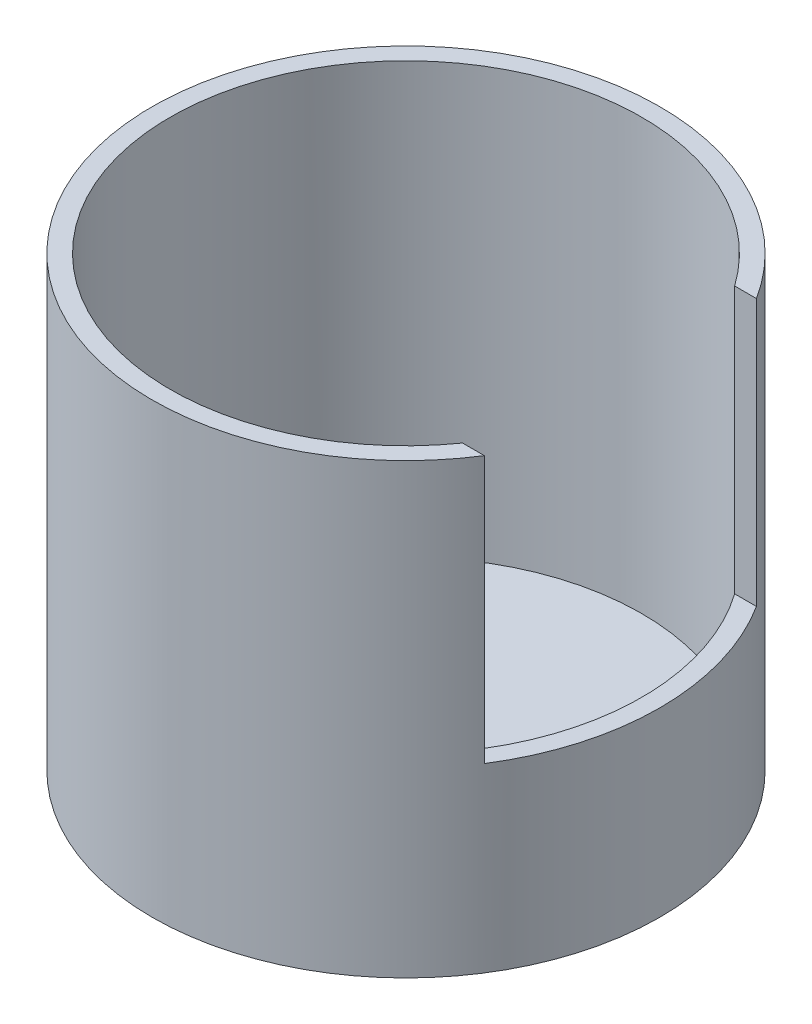
ISO-10303-21;
HEADER;
FILE_DESCRIPTION(('STEP AP214'),'2;1');
FILE_NAME('part.step','',(''),(''),'','','');
FILE_SCHEMA(('AUTOMOTIVE_DESIGN { 1 0 10303 214 1 1 1 1 }'));
ENDSEC;
DATA;
#1=APPLICATION_CONTEXT('core data for automotive mechanical design processes');
#2=APPLICATION_PROTOCOL_DEFINITION('international standard','automotive_design',2000,#1);
#3=PRODUCT_CONTEXT('',#1,'mechanical');
#4=PRODUCT('Part','Part','',(#3));
#5=PRODUCT_RELATED_PRODUCT_CATEGORY('part','',(#4));
#6=PRODUCT_DEFINITION_FORMATION('','',#4);
#7=PRODUCT_DEFINITION_CONTEXT('part definition',#1,'design');
#8=PRODUCT_DEFINITION('design','',#6,#7);
#9=PRODUCT_DEFINITION_SHAPE('','',#8);
#10=(LENGTH_UNIT() NAMED_UNIT(*) SI_UNIT(.MILLI.,.METRE.));
#11=(NAMED_UNIT(*) PLANE_ANGLE_UNIT() SI_UNIT($,.RADIAN.));
#12=(NAMED_UNIT(*) SI_UNIT($,.STERADIAN.) SOLID_ANGLE_UNIT());
#13=UNCERTAINTY_MEASURE_WITH_UNIT(LENGTH_MEASURE(1.E-05),#10,'distance_accuracy_value','');
#14=(GEOMETRIC_REPRESENTATION_CONTEXT(3) GLOBAL_UNCERTAINTY_ASSIGNED_CONTEXT((#13)) GLOBAL_UNIT_ASSIGNED_CONTEXT((#10,
#11,#12)) REPRESENTATION_CONTEXT('',''));
#15=CARTESIAN_POINT('',(0.,0.,0.));
#16=DIRECTION('',(0.,0.,1.));
#17=DIRECTION('',(1.,0.,0.));
#18=AXIS2_PLACEMENT_3D('',#15,#16,#17);
#19=CARTESIAN_POINT('',(0.,24.7,0.));
#20=DIRECTION('',(0.,-1.,0.));
#21=DIRECTION('',(0.,0.,-1.));
#22=AXIS2_PLACEMENT_3D('',#19,#20,#21);
#23=CYLINDRICAL_SURFACE('',#22,14.);
#24=CARTESIAN_POINT('',(0.,0.,0.));
#25=DIRECTION('',(0.,1.,0.));
#26=DIRECTION('',(0.,0.,1.));
#27=AXIS2_PLACEMENT_3D('',#24,#25,#26);
#28=CIRCLE('',#27,14.);
#29=CARTESIAN_POINT('',(0.,0.,14.));
#30=VERTEX_POINT('',#29);
#31=EDGE_CURVE('E94',#30,#30,#28,.T.);
#32=ORIENTED_EDGE('',*,*,#31,.T.);
#33=EDGE_LOOP('',(#32));
#34=FACE_BOUND('',#33,.T.);
#35=DIRECTION('',(0.,-1.,0.));
#36=VECTOR('',#35,1.);
#37=CARTESIAN_POINT('',(11.8215904175369,24.7,7.5));
#38=LINE('',#37,#36);
#39=CARTESIAN_POINT('',(11.8215904175369,24.7,7.5));
#40=VERTEX_POINT('',#39);
#41=CARTESIAN_POINT('',(11.8215904175369,10.,7.5));
#42=VERTEX_POINT('',#41);
#43=EDGE_CURVE('E78',#40,#42,#38,.T.);
#44=ORIENTED_EDGE('',*,*,#43,.F.);
#45=CARTESIAN_POINT('',(0.,24.7,0.));
#46=DIRECTION('',(0.,1.,0.));
#47=DIRECTION('',(0.,0.,1.));
#48=AXIS2_PLACEMENT_3D('',#45,#46,#47);
#49=CIRCLE('',#48,14.);
#50=CARTESIAN_POINT('',(11.8215904175369,24.7,-7.5));
#51=VERTEX_POINT('',#50);
#52=EDGE_CURVE('E88',#51,#40,#49,.T.);
#53=ORIENTED_EDGE('',*,*,#52,.F.);
#54=DIRECTION('',(0.,-1.,0.));
#55=VECTOR('',#54,1.);
#56=CARTESIAN_POINT('',(11.8215904175369,24.7,-7.5));
#57=LINE('',#56,#55);
#58=CARTESIAN_POINT('',(11.8215904175369,10.,-7.5));
#59=VERTEX_POINT('',#58);
#60=EDGE_CURVE('E109',#59,#51,#57,.F.);
#61=ORIENTED_EDGE('',*,*,#60,.F.);
#62=CARTESIAN_POINT('',(0.,10.,0.));
#63=DIRECTION('',(0.,1.,0.));
#64=DIRECTION('',(0.,0.,1.));
#65=AXIS2_PLACEMENT_3D('',#62,#63,#64);
#66=CIRCLE('',#65,14.);
#67=EDGE_CURVE('E89',#42,#59,#66,.T.);
#68=ORIENTED_EDGE('',*,*,#67,.F.);
#69=EDGE_LOOP('',(#44,#53,#61,#68));
#70=FACE_BOUND('',#69,.T.);
#71=ADVANCED_FACE('F35',(#34,#70),#23,.T.);
#72=CARTESIAN_POINT('',(0.,24.7,0.));
#73=DIRECTION('',(0.,1.,0.));
#74=DIRECTION('',(0.,0.,1.));
#75=AXIS2_PLACEMENT_3D('',#72,#73,#74);
#76=PLANE('',#75);
#77=ORIENTED_EDGE('',*,*,#52,.T.);
#78=DIRECTION('',(-1.,0.,0.));
#79=VECTOR('',#78,1.);
#80=CARTESIAN_POINT('',(24.7,24.7,7.5));
#81=LINE('',#80,#79);
#82=CARTESIAN_POINT('',(10.6183802907976,24.7,7.5));
#83=VERTEX_POINT('',#82);
#84=EDGE_CURVE('E75',#40,#83,#81,.T.);
#85=ORIENTED_EDGE('',*,*,#84,.T.);
#86=CARTESIAN_POINT('',(0.,24.7,0.));
#87=DIRECTION('',(0.,1.,0.));
#88=DIRECTION('',(0.,0.,1.));
#89=AXIS2_PLACEMENT_3D('',#86,#87,#88);
#90=CIRCLE('',#89,13.);
#91=CARTESIAN_POINT('',(10.6183802907977,24.7,-7.5));
#92=VERTEX_POINT('',#91);
#93=EDGE_CURVE('E98',#92,#83,#90,.T.);
#94=ORIENTED_EDGE('',*,*,#93,.F.);
#95=DIRECTION('',(-1.,0.,0.));
#96=VECTOR('',#95,1.);
#97=CARTESIAN_POINT('',(24.7,24.7,-7.5));
#98=LINE('',#97,#96);
#99=EDGE_CURVE('E49',#51,#92,#98,.T.);
#100=ORIENTED_EDGE('',*,*,#99,.F.);
#101=EDGE_LOOP('',(#77,#85,#94,#100));
#102=FACE_BOUND('',#101,.T.);
#103=ADVANCED_FACE('F92',(#102),#76,.T.);
#104=CARTESIAN_POINT('',(0.,24.7,0.));
#105=DIRECTION('',(0.,-1.,0.));
#106=DIRECTION('',(0.,0.,-1.));
#107=AXIS2_PLACEMENT_3D('',#104,#105,#106);
#108=CYLINDRICAL_SURFACE('',#107,13.);
#109=CARTESIAN_POINT('',(0.,1.,0.));
#110=DIRECTION('',(0.,1.,0.));
#111=DIRECTION('',(0.,0.,1.));
#112=AXIS2_PLACEMENT_3D('',#109,#110,#111);
#113=CIRCLE('',#112,13.);
#114=CARTESIAN_POINT('',(0.,1.,13.));
#115=VERTEX_POINT('',#114);
#116=EDGE_CURVE('E90',#115,#115,#113,.T.);
#117=ORIENTED_EDGE('',*,*,#116,.F.);
#118=EDGE_LOOP('',(#117));
#119=FACE_BOUND('',#118,.T.);
#120=ORIENTED_EDGE('',*,*,#93,.T.);
#121=DIRECTION('',(0.,-1.,0.));
#122=VECTOR('',#121,1.);
#123=CARTESIAN_POINT('',(10.6183802907976,24.7,7.5));
#124=LINE('',#123,#122);
#125=CARTESIAN_POINT('',(10.6183802907977,10.,7.5));
#126=VERTEX_POINT('',#125);
#127=EDGE_CURVE('E11',#83,#126,#124,.T.);
#128=ORIENTED_EDGE('',*,*,#127,.T.);
#129=CARTESIAN_POINT('',(0.,10.,0.));
#130=DIRECTION('',(0.,1.,0.));
#131=DIRECTION('',(0.,0.,1.));
#132=AXIS2_PLACEMENT_3D('',#129,#130,#131);
#133=CIRCLE('',#132,13.);
#134=CARTESIAN_POINT('',(10.6183802907977,10.,-7.5));
#135=VERTEX_POINT('',#134);
#136=EDGE_CURVE('E42',#126,#135,#133,.T.);
#137=ORIENTED_EDGE('',*,*,#136,.T.);
#138=DIRECTION('',(0.,-1.,0.));
#139=VECTOR('',#138,1.);
#140=CARTESIAN_POINT('',(10.6183802907977,24.7,-7.5));
#141=LINE('',#140,#139);
#142=EDGE_CURVE('E93',#135,#92,#141,.F.);
#143=ORIENTED_EDGE('',*,*,#142,.T.);
#144=EDGE_LOOP('',(#120,#128,#137,#143));
#145=FACE_BOUND('',#144,.T.);
#146=ADVANCED_FACE('F103',(#119,#145),#108,.F.);
#147=CARTESIAN_POINT('',(0.,0.,0.));
#148=DIRECTION('',(0.,1.,0.));
#149=DIRECTION('',(0.,0.,1.));
#150=AXIS2_PLACEMENT_3D('',#147,#148,#149);
#151=PLANE('',#150);
#152=ORIENTED_EDGE('',*,*,#31,.F.);
#153=EDGE_LOOP('',(#152));
#154=FACE_BOUND('',#153,.T.);
#155=ADVANCED_FACE('F132',(#154),#151,.F.);
#156=CARTESIAN_POINT('',(0.,1.,0.));
#157=DIRECTION('',(0.,1.,0.));
#158=DIRECTION('',(0.,0.,1.));
#159=AXIS2_PLACEMENT_3D('',#156,#157,#158);
#160=PLANE('',#159);
#161=ORIENTED_EDGE('',*,*,#116,.T.);
#162=EDGE_LOOP('',(#161));
#163=FACE_BOUND('',#162,.T.);
#164=ADVANCED_FACE('F134',(#163),#160,.T.);
#165=CARTESIAN_POINT('',(24.7,24.7,7.5));
#166=DIRECTION('',(0.,0.,-1.));
#167=DIRECTION('',(0.,1.,0.));
#168=AXIS2_PLACEMENT_3D('',#165,#166,#167);
#169=PLANE('',#168);
#170=ORIENTED_EDGE('',*,*,#43,.T.);
#171=DIRECTION('',(-1.,0.,0.));
#172=VECTOR('',#171,1.);
#173=CARTESIAN_POINT('',(24.7,10.,7.5));
#174=LINE('',#173,#172);
#175=EDGE_CURVE('E111',#42,#126,#174,.T.);
#176=ORIENTED_EDGE('',*,*,#175,.T.);
#177=ORIENTED_EDGE('',*,*,#127,.F.);
#178=ORIENTED_EDGE('',*,*,#84,.F.);
#179=EDGE_LOOP('',(#170,#176,#177,#178));
#180=FACE_BOUND('',#179,.T.);
#181=ADVANCED_FACE('F77',(#180),#169,.T.);
#182=CARTESIAN_POINT('',(24.7,10.,7.5));
#183=DIRECTION('',(0.,1.,0.));
#184=DIRECTION('',(0.,0.,1.));
#185=AXIS2_PLACEMENT_3D('',#182,#183,#184);
#186=PLANE('',#185);
#187=ORIENTED_EDGE('',*,*,#67,.T.);
#188=DIRECTION('',(-1.,0.,0.));
#189=VECTOR('',#188,1.);
#190=CARTESIAN_POINT('',(24.7,10.,-7.5));
#191=LINE('',#190,#189);
#192=EDGE_CURVE('E113',#59,#135,#191,.T.);
#193=ORIENTED_EDGE('',*,*,#192,.T.);
#194=ORIENTED_EDGE('',*,*,#136,.F.);
#195=ORIENTED_EDGE('',*,*,#175,.F.);
#196=EDGE_LOOP('',(#187,#193,#194,#195));
#197=FACE_BOUND('',#196,.T.);
#198=ADVANCED_FACE('F116',(#197),#186,.T.);
#199=CARTESIAN_POINT('',(24.7,24.7,-7.5));
#200=DIRECTION('',(0.,0.,1.));
#201=DIRECTION('',(0.,-1.,0.));
#202=AXIS2_PLACEMENT_3D('',#199,#200,#201);
#203=PLANE('',#202);
#204=ORIENTED_EDGE('',*,*,#60,.T.);
#205=ORIENTED_EDGE('',*,*,#99,.T.);
#206=ORIENTED_EDGE('',*,*,#142,.F.);
#207=ORIENTED_EDGE('',*,*,#192,.F.);
#208=EDGE_LOOP('',(#204,#205,#206,#207));
#209=FACE_BOUND('',#208,.T.);
#210=ADVANCED_FACE('F117',(#209),#203,.T.);
#211=CLOSED_SHELL('',(#71,#103,#146,#155,#164,#181,#198,#210));
#212=MANIFOLD_SOLID_BREP('B2',#211);
#213=ADVANCED_BREP_SHAPE_REPRESENTATION('',(#18,#212),#14);
#214=SHAPE_DEFINITION_REPRESENTATION(#9,#213);
ENDSEC;
END-ISO-10303-21;
